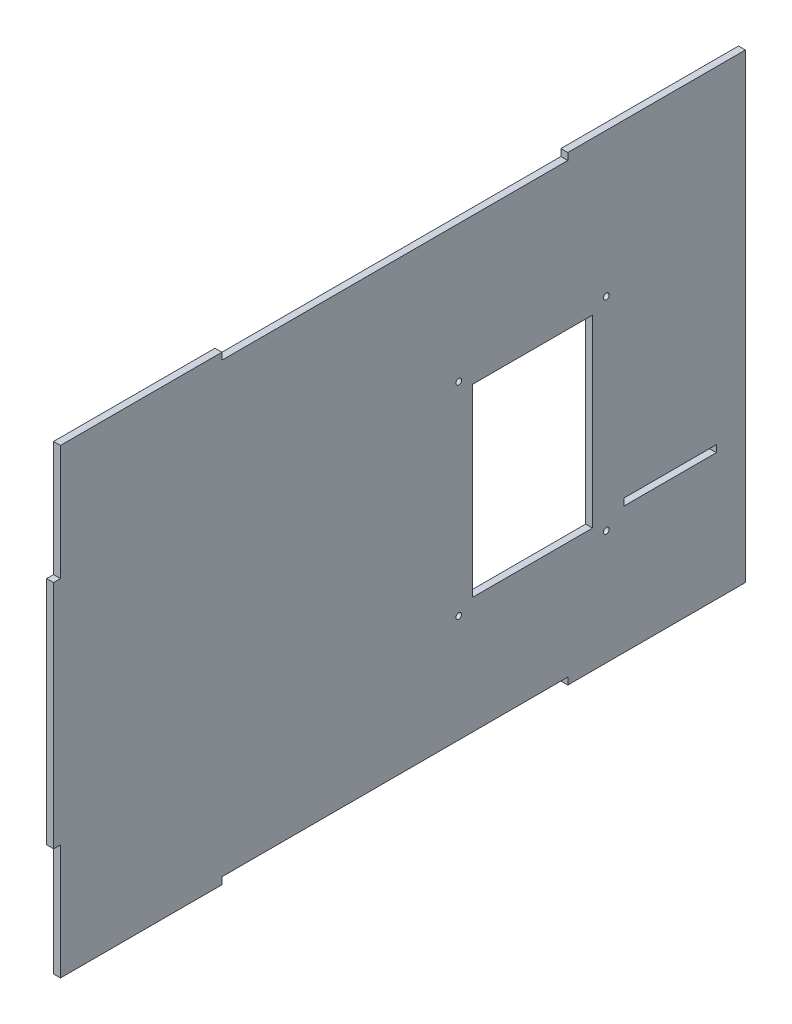
ISO-10303-21;
HEADER;
FILE_DESCRIPTION(('STEP AP214'),'2;1');
FILE_NAME('part.step','',(''),(''),'','','');
FILE_SCHEMA(('AUTOMOTIVE_DESIGN { 1 0 10303 214 1 1 1 1 }'));
ENDSEC;
DATA;
#1=APPLICATION_CONTEXT('core data for automotive mechanical design processes');
#2=APPLICATION_PROTOCOL_DEFINITION('international standard','automotive_design',2000,#1);
#3=PRODUCT_CONTEXT('',#1,'mechanical');
#4=PRODUCT('Part','Part','',(#3));
#5=PRODUCT_RELATED_PRODUCT_CATEGORY('part','',(#4));
#6=PRODUCT_DEFINITION_FORMATION('','',#4);
#7=PRODUCT_DEFINITION_CONTEXT('part definition',#1,'design');
#8=PRODUCT_DEFINITION('design','',#6,#7);
#9=PRODUCT_DEFINITION_SHAPE('','',#8);
#10=(LENGTH_UNIT() NAMED_UNIT(*) SI_UNIT(.MILLI.,.METRE.));
#11=(NAMED_UNIT(*) PLANE_ANGLE_UNIT() SI_UNIT($,.RADIAN.));
#12=(NAMED_UNIT(*) SI_UNIT($,.STERADIAN.) SOLID_ANGLE_UNIT());
#13=UNCERTAINTY_MEASURE_WITH_UNIT(LENGTH_MEASURE(1.E-05),#10,'distance_accuracy_value','');
#14=(GEOMETRIC_REPRESENTATION_CONTEXT(3) GLOBAL_UNCERTAINTY_ASSIGNED_CONTEXT((#13)) GLOBAL_UNIT_ASSIGNED_CONTEXT((#10,
#11,#12)) REPRESENTATION_CONTEXT('',''));
#15=CARTESIAN_POINT('',(0.,0.,0.));
#16=DIRECTION('',(0.,0.,1.));
#17=DIRECTION('',(1.,0.,0.));
#18=AXIS2_PLACEMENT_3D('',#15,#16,#17);
#19=CARTESIAN_POINT('',(3.,0.,0.));
#20=DIRECTION('',(1.,0.,0.));
#21=DIRECTION('',(0.,1.,0.));
#22=AXIS2_PLACEMENT_3D('',#19,#20,#21);
#23=PLANE('',#22);
#24=DIRECTION('',(0.,1.,0.));
#25=VECTOR('',#24,1.);
#26=CARTESIAN_POINT('',(3.,33.6,-181.72));
#27=LINE('',#26,#25);
#28=CARTESIAN_POINT('',(3.,-46.4,-181.72));
#29=VERTEX_POINT('',#28);
#30=CARTESIAN_POINT('',(3.,33.6,-181.72));
#31=VERTEX_POINT('',#30);
#32=EDGE_CURVE('E204',#29,#31,#27,.T.);
#33=ORIENTED_EDGE('',*,*,#32,.T.);
#34=DIRECTION('',(0.,0.,-1.));
#35=VECTOR('',#34,1.);
#36=CARTESIAN_POINT('',(3.,33.6,-233.72));
#37=LINE('',#36,#35);
#38=CARTESIAN_POINT('',(3.,33.6,-233.72));
#39=VERTEX_POINT('',#38);
#40=EDGE_CURVE('E184',#31,#39,#37,.T.);
#41=ORIENTED_EDGE('',*,*,#40,.T.);
#42=DIRECTION('',(0.,-1.,0.));
#43=VECTOR('',#42,1.);
#44=CARTESIAN_POINT('',(3.,-46.4,-233.72));
#45=LINE('',#44,#43);
#46=CARTESIAN_POINT('',(3.,-46.4,-233.72));
#47=VERTEX_POINT('',#46);
#48=EDGE_CURVE('E31',#39,#47,#45,.T.);
#49=ORIENTED_EDGE('',*,*,#48,.T.);
#50=DIRECTION('',(0.,0.,1.));
#51=VECTOR('',#50,1.);
#52=CARTESIAN_POINT('',(3.,-46.4,-181.72));
#53=LINE('',#52,#51);
#54=EDGE_CURVE('E201',#47,#29,#53,.T.);
#55=ORIENTED_EDGE('',*,*,#54,.T.);
#56=EDGE_LOOP('',(#33,#41,#49,#55));
#57=FACE_BOUND('',#56,.T.);
#58=DIRECTION('',(0.,-1.,0.));
#59=VECTOR('',#58,1.);
#60=CARTESIAN_POINT('',(3.,-44.93,-287.43));
#61=LINE('',#60,#59);
#62=CARTESIAN_POINT('',(3.,-41.93,-287.43));
#63=VERTEX_POINT('',#62);
#64=CARTESIAN_POINT('',(3.,-44.93,-287.43));
#65=VERTEX_POINT('',#64);
#66=EDGE_CURVE('E226',#63,#65,#61,.T.);
#67=ORIENTED_EDGE('',*,*,#66,.T.);
#68=DIRECTION('',(0.,0.,1.));
#69=VECTOR('',#68,1.);
#70=CARTESIAN_POINT('',(3.,-44.93,-247.43));
#71=LINE('',#70,#69);
#72=CARTESIAN_POINT('',(3.,-44.93,-247.43));
#73=VERTEX_POINT('',#72);
#74=EDGE_CURVE('E238',#65,#73,#71,.T.);
#75=ORIENTED_EDGE('',*,*,#74,.T.);
#76=DIRECTION('',(0.,1.,0.));
#77=VECTOR('',#76,1.);
#78=CARTESIAN_POINT('',(3.,-41.93,-247.43));
#79=LINE('',#78,#77);
#80=CARTESIAN_POINT('',(3.,-41.93,-247.43));
#81=VERTEX_POINT('',#80);
#82=EDGE_CURVE('E220',#73,#81,#79,.T.);
#83=ORIENTED_EDGE('',*,*,#82,.T.);
#84=DIRECTION('',(0.,0.,-1.));
#85=VECTOR('',#84,1.);
#86=CARTESIAN_POINT('',(3.,-41.93,-287.43));
#87=LINE('',#86,#85);
#88=EDGE_CURVE('E223',#81,#63,#87,.T.);
#89=ORIENTED_EDGE('',*,*,#88,.T.);
#90=EDGE_LOOP('',(#67,#75,#83,#89));
#91=FACE_BOUND('',#90,.T.);
#92=CARTESIAN_POINT('',(3.,37.6,-239.72));
#93=DIRECTION('',(1.,0.,0.));
#94=DIRECTION('',(0.,1.,0.));
#95=AXIS2_PLACEMENT_3D('',#92,#93,#94);
#96=CIRCLE('',#95,1.25);
#97=CARTESIAN_POINT('',(3.,38.85,-239.72));
#98=VERTEX_POINT('',#97);
#99=EDGE_CURVE('E250',#98,#98,#96,.T.);
#100=ORIENTED_EDGE('',*,*,#99,.F.);
#101=EDGE_LOOP('',(#100));
#102=FACE_BOUND('',#101,.T.);
#103=CARTESIAN_POINT('',(3.,-50.4,-175.72));
#104=DIRECTION('',(1.,0.,0.));
#105=DIRECTION('',(0.,1.,0.));
#106=AXIS2_PLACEMENT_3D('',#103,#104,#105);
#107=CIRCLE('',#106,1.25);
#108=CARTESIAN_POINT('',(3.,-49.15,-175.72));
#109=VERTEX_POINT('',#108);
#110=EDGE_CURVE('E262',#109,#109,#107,.T.);
#111=ORIENTED_EDGE('',*,*,#110,.F.);
#112=EDGE_LOOP('',(#111));
#113=FACE_BOUND('',#112,.T.);
#114=DIRECTION('',(0.,-1.,0.));
#115=VECTOR('',#114,1.);
#116=CARTESIAN_POINT('',(2.99999999999999,-100.,-3.));
#117=LINE('',#116,#115);
#118=CARTESIAN_POINT('',(3.,-50.,-3.));
#119=VERTEX_POINT('',#118);
#120=CARTESIAN_POINT('',(2.99999999999999,-100.,-3.));
#121=VERTEX_POINT('',#120);
#122=EDGE_CURVE('E335',#119,#121,#117,.T.);
#123=ORIENTED_EDGE('',*,*,#122,.T.);
#124=DIRECTION('',(0.,0.,-1.));
#125=VECTOR('',#124,1.);
#126=CARTESIAN_POINT('',(2.99999999999999,-100.,-3.));
#127=LINE('',#126,#125);
#128=CARTESIAN_POINT('',(2.99999999999999,-100.,-73.));
#129=VERTEX_POINT('',#128);
#130=EDGE_CURVE('E332',#121,#129,#127,.T.);
#131=ORIENTED_EDGE('',*,*,#130,.T.);
#132=DIRECTION('',(0.,1.,0.));
#133=VECTOR('',#132,1.);
#134=CARTESIAN_POINT('',(2.99999999999999,-100.,-73.));
#135=LINE('',#134,#133);
#136=CARTESIAN_POINT('',(2.99999999999999,-97.,-73.));
#137=VERTEX_POINT('',#136);
#138=EDGE_CURVE('E334',#129,#137,#135,.T.);
#139=ORIENTED_EDGE('',*,*,#138,.T.);
#140=DIRECTION('',(0.,0.,-1.));
#141=VECTOR('',#140,1.);
#142=CARTESIAN_POINT('',(2.99999999999999,-97.,-73.));
#143=LINE('',#142,#141);
#144=CARTESIAN_POINT('',(2.99999999999999,-97.,-223.));
#145=VERTEX_POINT('',#144);
#146=EDGE_CURVE('E337',#137,#145,#143,.T.);
#147=ORIENTED_EDGE('',*,*,#146,.T.);
#148=DIRECTION('',(0.,-1.,0.));
#149=VECTOR('',#148,1.);
#150=CARTESIAN_POINT('',(2.99999999999999,-97.,-223.));
#151=LINE('',#150,#149);
#152=CARTESIAN_POINT('',(2.99999999999999,-100.,-223.));
#153=VERTEX_POINT('',#152);
#154=EDGE_CURVE('E339',#145,#153,#151,.T.);
#155=ORIENTED_EDGE('',*,*,#154,.T.);
#156=DIRECTION('',(0.,0.,-1.));
#157=VECTOR('',#156,1.);
#158=CARTESIAN_POINT('',(2.99999999999999,-100.,-223.));
#159=LINE('',#158,#157);
#160=CARTESIAN_POINT('',(2.99999999999999,-100.,-300.));
#161=VERTEX_POINT('',#160);
#162=EDGE_CURVE('E341',#153,#161,#159,.T.);
#163=ORIENTED_EDGE('',*,*,#162,.T.);
#164=DIRECTION('',(0.,1.,0.));
#165=VECTOR('',#164,1.);
#166=CARTESIAN_POINT('',(2.99999999999999,-100.,-300.));
#167=LINE('',#166,#165);
#168=CARTESIAN_POINT('',(2.99999999999999,100.,-300.));
#169=VERTEX_POINT('',#168);
#170=EDGE_CURVE('E343',#161,#169,#167,.T.);
#171=ORIENTED_EDGE('',*,*,#170,.T.);
#172=DIRECTION('',(0.,0.,1.));
#173=VECTOR('',#172,1.);
#174=CARTESIAN_POINT('',(2.99999999999999,100.,-300.));
#175=LINE('',#174,#173);
#176=CARTESIAN_POINT('',(2.99999999999999,100.,-223.));
#177=VERTEX_POINT('',#176);
#178=EDGE_CURVE('E275',#169,#177,#175,.T.);
#179=ORIENTED_EDGE('',*,*,#178,.T.);
#180=DIRECTION('',(0.,-1.,0.));
#181=VECTOR('',#180,1.);
#182=CARTESIAN_POINT('',(2.99999999999999,100.,-223.));
#183=LINE('',#182,#181);
#184=CARTESIAN_POINT('',(2.99999999999999,97.,-223.));
#185=VERTEX_POINT('',#184);
#186=EDGE_CURVE('E277',#177,#185,#183,.T.);
#187=ORIENTED_EDGE('',*,*,#186,.T.);
#188=DIRECTION('',(0.,0.,1.));
#189=VECTOR('',#188,1.);
#190=CARTESIAN_POINT('',(2.99999999999999,97.,-223.));
#191=LINE('',#190,#189);
#192=CARTESIAN_POINT('',(2.99999999999999,97.,-73.));
#193=VERTEX_POINT('',#192);
#194=EDGE_CURVE('E279',#185,#193,#191,.T.);
#195=ORIENTED_EDGE('',*,*,#194,.T.);
#196=DIRECTION('',(0.,1.,0.));
#197=VECTOR('',#196,1.);
#198=CARTESIAN_POINT('',(2.99999999999999,97.,-73.));
#199=LINE('',#198,#197);
#200=CARTESIAN_POINT('',(2.99999999999999,100.,-73.));
#201=VERTEX_POINT('',#200);
#202=EDGE_CURVE('E281',#193,#201,#199,.T.);
#203=ORIENTED_EDGE('',*,*,#202,.T.);
#204=DIRECTION('',(0.,0.,1.));
#205=VECTOR('',#204,1.);
#206=CARTESIAN_POINT('',(2.99999999999999,100.,-73.));
#207=LINE('',#206,#205);
#208=CARTESIAN_POINT('',(2.99999999999999,100.,-3.));
#209=VERTEX_POINT('',#208);
#210=EDGE_CURVE('E272',#201,#209,#207,.T.);
#211=ORIENTED_EDGE('',*,*,#210,.T.);
#212=DIRECTION('',(0.,-1.,0.));
#213=VECTOR('',#212,1.);
#214=CARTESIAN_POINT('',(2.99999999999999,100.,-3.));
#215=LINE('',#214,#213);
#216=CARTESIAN_POINT('',(3.,50.,-3.));
#217=VERTEX_POINT('',#216);
#218=EDGE_CURVE('E269',#209,#217,#215,.T.);
#219=ORIENTED_EDGE('',*,*,#218,.T.);
#220=DIRECTION('',(0.,0.,1.));
#221=VECTOR('',#220,1.);
#222=CARTESIAN_POINT('',(3.,50.,-3.));
#223=LINE('',#222,#221);
#224=CARTESIAN_POINT('',(3.,50.,0.));
#225=VERTEX_POINT('',#224);
#226=EDGE_CURVE('E271',#217,#225,#223,.T.);
#227=ORIENTED_EDGE('',*,*,#226,.T.);
#228=DIRECTION('',(0.,-1.,0.));
#229=VECTOR('',#228,1.);
#230=CARTESIAN_POINT('',(3.,-50.,0.));
#231=LINE('',#230,#229);
#232=CARTESIAN_POINT('',(3.,-50.,0.));
#233=VERTEX_POINT('',#232);
#234=EDGE_CURVE('E345',#225,#233,#231,.T.);
#235=ORIENTED_EDGE('',*,*,#234,.T.);
#236=DIRECTION('',(0.,0.,-1.));
#237=VECTOR('',#236,1.);
#238=CARTESIAN_POINT('',(3.,-50.,-3.));
#239=LINE('',#238,#237);
#240=EDGE_CURVE('E347',#233,#119,#239,.T.);
#241=ORIENTED_EDGE('',*,*,#240,.T.);
#242=EDGE_LOOP('',(#123,#131,#139,#147,#155,#163,#171,#179,#187,#195,#203,#211,#219,#227,#235,#241));
#243=FACE_BOUND('',#242,.T.);
#244=CARTESIAN_POINT('',(3.,37.6,-175.72));
#245=DIRECTION('',(1.,0.,0.));
#246=DIRECTION('',(0.,1.,0.));
#247=AXIS2_PLACEMENT_3D('',#244,#245,#246);
#248=CIRCLE('',#247,1.25);
#249=CARTESIAN_POINT('',(3.,38.85,-175.72));
#250=VERTEX_POINT('',#249);
#251=EDGE_CURVE('E256',#250,#250,#248,.T.);
#252=ORIENTED_EDGE('',*,*,#251,.F.);
#253=EDGE_LOOP('',(#252));
#254=FACE_BOUND('',#253,.T.);
#255=CARTESIAN_POINT('',(3.,-50.4,-239.72));
#256=DIRECTION('',(1.,0.,0.));
#257=DIRECTION('',(0.,1.,0.));
#258=AXIS2_PLACEMENT_3D('',#255,#256,#257);
#259=CIRCLE('',#258,1.25);
#260=CARTESIAN_POINT('',(3.,-49.15,-239.72));
#261=VERTEX_POINT('',#260);
#262=EDGE_CURVE('E244',#261,#261,#259,.T.);
#263=ORIENTED_EDGE('',*,*,#262,.F.);
#264=EDGE_LOOP('',(#263));
#265=FACE_BOUND('',#264,.T.);
#266=ADVANCED_FACE('F16',(#57,#91,#102,#113,#243,#254,#265),#23,.T.);
#267=CARTESIAN_POINT('',(0.,0.,0.));
#268=DIRECTION('',(1.,0.,0.));
#269=DIRECTION('',(0.,1.,0.));
#270=AXIS2_PLACEMENT_3D('',#267,#268,#269);
#271=PLANE('',#270);
#272=DIRECTION('',(0.,0.,1.));
#273=VECTOR('',#272,1.);
#274=CARTESIAN_POINT('',(0.,33.6,-233.72));
#275=LINE('',#274,#273);
#276=CARTESIAN_POINT('',(0.,33.6,-233.72));
#277=VERTEX_POINT('',#276);
#278=CARTESIAN_POINT('',(0.,33.6,-181.72));
#279=VERTEX_POINT('',#278);
#280=EDGE_CURVE('E176',#277,#279,#275,.T.);
#281=ORIENTED_EDGE('',*,*,#280,.T.);
#282=DIRECTION('',(0.,-1.,0.));
#283=VECTOR('',#282,1.);
#284=CARTESIAN_POINT('',(0.,33.6,-181.72));
#285=LINE('',#284,#283);
#286=CARTESIAN_POINT('',(0.,-46.4,-181.72));
#287=VERTEX_POINT('',#286);
#288=EDGE_CURVE('E196',#279,#287,#285,.T.);
#289=ORIENTED_EDGE('',*,*,#288,.T.);
#290=DIRECTION('',(0.,0.,-1.));
#291=VECTOR('',#290,1.);
#292=CARTESIAN_POINT('',(0.,-46.4,-181.72));
#293=LINE('',#292,#291);
#294=CARTESIAN_POINT('',(0.,-46.4,-233.72));
#295=VERTEX_POINT('',#294);
#296=EDGE_CURVE('E194',#287,#295,#293,.T.);
#297=ORIENTED_EDGE('',*,*,#296,.T.);
#298=DIRECTION('',(0.,1.,0.));
#299=VECTOR('',#298,1.);
#300=CARTESIAN_POINT('',(0.,-46.4,-233.72));
#301=LINE('',#300,#299);
#302=EDGE_CURVE('E187',#295,#277,#301,.T.);
#303=ORIENTED_EDGE('',*,*,#302,.T.);
#304=EDGE_LOOP('',(#281,#289,#297,#303));
#305=FACE_BOUND('',#304,.T.);
#306=DIRECTION('',(0.,0.,-1.));
#307=VECTOR('',#306,1.);
#308=CARTESIAN_POINT('',(0.,-44.93,-247.43));
#309=LINE('',#308,#307);
#310=CARTESIAN_POINT('',(0.,-44.93,-247.43));
#311=VERTEX_POINT('',#310);
#312=CARTESIAN_POINT('',(0.,-44.93,-287.43));
#313=VERTEX_POINT('',#312);
#314=EDGE_CURVE('E241',#311,#313,#309,.T.);
#315=ORIENTED_EDGE('',*,*,#314,.T.);
#316=DIRECTION('',(0.,1.,0.));
#317=VECTOR('',#316,1.);
#318=CARTESIAN_POINT('',(0.,-44.93,-287.43));
#319=LINE('',#318,#317);
#320=CARTESIAN_POINT('',(0.,-41.93,-287.43));
#321=VERTEX_POINT('',#320);
#322=EDGE_CURVE('E217',#313,#321,#319,.T.);
#323=ORIENTED_EDGE('',*,*,#322,.T.);
#324=DIRECTION('',(0.,0.,1.));
#325=VECTOR('',#324,1.);
#326=CARTESIAN_POINT('',(0.,-41.93,-287.43));
#327=LINE('',#326,#325);
#328=CARTESIAN_POINT('',(0.,-41.93,-247.43));
#329=VERTEX_POINT('',#328);
#330=EDGE_CURVE('E214',#321,#329,#327,.T.);
#331=ORIENTED_EDGE('',*,*,#330,.T.);
#332=DIRECTION('',(0.,-1.,0.));
#333=VECTOR('',#332,1.);
#334=CARTESIAN_POINT('',(0.,-41.93,-247.43));
#335=LINE('',#334,#333);
#336=EDGE_CURVE('E183',#329,#311,#335,.T.);
#337=ORIENTED_EDGE('',*,*,#336,.T.);
#338=EDGE_LOOP('',(#315,#323,#331,#337));
#339=FACE_BOUND('',#338,.T.);
#340=CARTESIAN_POINT('',(0.,37.6,-239.72));
#341=DIRECTION('',(-1.,0.,0.));
#342=DIRECTION('',(0.,-1.,0.));
#343=AXIS2_PLACEMENT_3D('',#340,#341,#342);
#344=CIRCLE('',#343,1.25);
#345=CARTESIAN_POINT('',(0.,36.35,-239.72));
#346=VERTEX_POINT('',#345);
#347=EDGE_CURVE('E253',#346,#346,#344,.T.);
#348=ORIENTED_EDGE('',*,*,#347,.F.);
#349=EDGE_LOOP('',(#348));
#350=FACE_BOUND('',#349,.T.);
#351=CARTESIAN_POINT('',(0.,-50.4,-175.72));
#352=DIRECTION('',(-1.,0.,0.));
#353=DIRECTION('',(0.,-1.,0.));
#354=AXIS2_PLACEMENT_3D('',#351,#352,#353);
#355=CIRCLE('',#354,1.25);
#356=CARTESIAN_POINT('',(0.,-51.65,-175.72));
#357=VERTEX_POINT('',#356);
#358=EDGE_CURVE('E265',#357,#357,#355,.T.);
#359=ORIENTED_EDGE('',*,*,#358,.F.);
#360=EDGE_LOOP('',(#359));
#361=FACE_BOUND('',#360,.T.);
#362=DIRECTION('',(0.,-1.,0.));
#363=VECTOR('',#362,1.);
#364=CARTESIAN_POINT('',(0.,-100.,-3.));
#365=LINE('',#364,#363);
#366=CARTESIAN_POINT('',(0.,-50.,-3.));
#367=VERTEX_POINT('',#366);
#368=CARTESIAN_POINT('',(0.,-100.,-3.));
#369=VERTEX_POINT('',#368);
#370=EDGE_CURVE('E331',#367,#369,#365,.T.);
#371=ORIENTED_EDGE('',*,*,#370,.F.);
#372=DIRECTION('',(0.,0.,-1.));
#373=VECTOR('',#372,1.);
#374=CARTESIAN_POINT('',(0.,-50.,-3.));
#375=LINE('',#374,#373);
#376=CARTESIAN_POINT('',(0.,-50.,0.));
#377=VERTEX_POINT('',#376);
#378=EDGE_CURVE('E352',#377,#367,#375,.T.);
#379=ORIENTED_EDGE('',*,*,#378,.F.);
#380=DIRECTION('',(0.,-1.,0.));
#381=VECTOR('',#380,1.);
#382=CARTESIAN_POINT('',(0.,-50.,0.));
#383=LINE('',#382,#381);
#384=CARTESIAN_POINT('',(0.,50.,0.));
#385=VERTEX_POINT('',#384);
#386=EDGE_CURVE('E371',#385,#377,#383,.T.);
#387=ORIENTED_EDGE('',*,*,#386,.F.);
#388=DIRECTION('',(0.,0.,1.));
#389=VECTOR('',#388,1.);
#390=CARTESIAN_POINT('',(0.,50.,-3.));
#391=LINE('',#390,#389);
#392=CARTESIAN_POINT('',(0.,50.,-3.));
#393=VERTEX_POINT('',#392);
#394=EDGE_CURVE('E290',#393,#385,#391,.T.);
#395=ORIENTED_EDGE('',*,*,#394,.F.);
#396=DIRECTION('',(0.,-1.,0.));
#397=VECTOR('',#396,1.);
#398=CARTESIAN_POINT('',(0.,100.,-3.));
#399=LINE('',#398,#397);
#400=CARTESIAN_POINT('',(0.,100.,-3.));
#401=VERTEX_POINT('',#400);
#402=EDGE_CURVE('E287',#401,#393,#399,.T.);
#403=ORIENTED_EDGE('',*,*,#402,.F.);
#404=DIRECTION('',(0.,0.,1.));
#405=VECTOR('',#404,1.);
#406=CARTESIAN_POINT('',(0.,100.,-73.));
#407=LINE('',#406,#405);
#408=CARTESIAN_POINT('',(0.,100.,-73.));
#409=VERTEX_POINT('',#408);
#410=EDGE_CURVE('E268',#409,#401,#407,.T.);
#411=ORIENTED_EDGE('',*,*,#410,.F.);
#412=DIRECTION('',(0.,1.,0.));
#413=VECTOR('',#412,1.);
#414=CARTESIAN_POINT('',(0.,97.,-73.));
#415=LINE('',#414,#413);
#416=CARTESIAN_POINT('',(0.,97.,-73.));
#417=VERTEX_POINT('',#416);
#418=EDGE_CURVE('E286',#417,#409,#415,.T.);
#419=ORIENTED_EDGE('',*,*,#418,.F.);
#420=DIRECTION('',(0.,0.,1.));
#421=VECTOR('',#420,1.);
#422=CARTESIAN_POINT('',(0.,97.,-223.));
#423=LINE('',#422,#421);
#424=CARTESIAN_POINT('',(0.,97.,-223.));
#425=VERTEX_POINT('',#424);
#426=EDGE_CURVE('E300',#425,#417,#423,.T.);
#427=ORIENTED_EDGE('',*,*,#426,.F.);
#428=DIRECTION('',(0.,-1.,0.));
#429=VECTOR('',#428,1.);
#430=CARTESIAN_POINT('',(0.,100.,-223.));
#431=LINE('',#430,#429);
#432=CARTESIAN_POINT('',(0.,100.,-223.));
#433=VERTEX_POINT('',#432);
#434=EDGE_CURVE('E297',#433,#425,#431,.T.);
#435=ORIENTED_EDGE('',*,*,#434,.F.);
#436=DIRECTION('',(0.,0.,1.));
#437=VECTOR('',#436,1.);
#438=CARTESIAN_POINT('',(0.,100.,-300.));
#439=LINE('',#438,#437);
#440=CARTESIAN_POINT('',(0.,100.,-300.));
#441=VERTEX_POINT('',#440);
#442=EDGE_CURVE('E294',#441,#433,#439,.T.);
#443=ORIENTED_EDGE('',*,*,#442,.F.);
#444=DIRECTION('',(0.,1.,0.));
#445=VECTOR('',#444,1.);
#446=CARTESIAN_POINT('',(0.,-100.,-300.));
#447=LINE('',#446,#445);
#448=CARTESIAN_POINT('',(0.,-100.,-300.));
#449=VERTEX_POINT('',#448);
#450=EDGE_CURVE('E368',#449,#441,#447,.T.);
#451=ORIENTED_EDGE('',*,*,#450,.F.);
#452=DIRECTION('',(0.,0.,-1.));
#453=VECTOR('',#452,1.);
#454=CARTESIAN_POINT('',(0.,-100.,-223.));
#455=LINE('',#454,#453);
#456=CARTESIAN_POINT('',(0.,-100.,-223.));
#457=VERTEX_POINT('',#456);
#458=EDGE_CURVE('E365',#457,#449,#455,.T.);
#459=ORIENTED_EDGE('',*,*,#458,.F.);
#460=DIRECTION('',(0.,-1.,0.));
#461=VECTOR('',#460,1.);
#462=CARTESIAN_POINT('',(0.,-97.,-223.));
#463=LINE('',#462,#461);
#464=CARTESIAN_POINT('',(0.,-97.,-223.));
#465=VERTEX_POINT('',#464);
#466=EDGE_CURVE('E362',#465,#457,#463,.T.);
#467=ORIENTED_EDGE('',*,*,#466,.F.);
#468=DIRECTION('',(0.,0.,-1.));
#469=VECTOR('',#468,1.);
#470=CARTESIAN_POINT('',(0.,-97.,-73.));
#471=LINE('',#470,#469);
#472=CARTESIAN_POINT('',(0.,-97.,-73.));
#473=VERTEX_POINT('',#472);
#474=EDGE_CURVE('E359',#473,#465,#471,.T.);
#475=ORIENTED_EDGE('',*,*,#474,.F.);
#476=DIRECTION('',(0.,1.,0.));
#477=VECTOR('',#476,1.);
#478=CARTESIAN_POINT('',(0.,-100.,-73.));
#479=LINE('',#478,#477);
#480=CARTESIAN_POINT('',(0.,-100.,-73.));
#481=VERTEX_POINT('',#480);
#482=EDGE_CURVE('E356',#481,#473,#479,.T.);
#483=ORIENTED_EDGE('',*,*,#482,.F.);
#484=DIRECTION('',(0.,0.,-1.));
#485=VECTOR('',#484,1.);
#486=CARTESIAN_POINT('',(0.,-100.,-3.));
#487=LINE('',#486,#485);
#488=EDGE_CURVE('E353',#369,#481,#487,.T.);
#489=ORIENTED_EDGE('',*,*,#488,.F.);
#490=EDGE_LOOP('',(#371,#379,#387,#395,#403,#411,#419,#427,#435,#443,#451,#459,#467,#475,#483,#489));
#491=FACE_BOUND('',#490,.T.);
#492=CARTESIAN_POINT('',(0.,37.6,-175.72));
#493=DIRECTION('',(-1.,0.,0.));
#494=DIRECTION('',(0.,-1.,0.));
#495=AXIS2_PLACEMENT_3D('',#492,#493,#494);
#496=CIRCLE('',#495,1.25);
#497=CARTESIAN_POINT('',(0.,36.35,-175.72));
#498=VERTEX_POINT('',#497);
#499=EDGE_CURVE('E259',#498,#498,#496,.T.);
#500=ORIENTED_EDGE('',*,*,#499,.F.);
#501=EDGE_LOOP('',(#500));
#502=FACE_BOUND('',#501,.T.);
#503=CARTESIAN_POINT('',(0.,-50.4,-239.72));
#504=DIRECTION('',(-1.,0.,0.));
#505=DIRECTION('',(0.,-1.,0.));
#506=AXIS2_PLACEMENT_3D('',#503,#504,#505);
#507=CIRCLE('',#506,1.25);
#508=CARTESIAN_POINT('',(0.,-51.65,-239.72));
#509=VERTEX_POINT('',#508);
#510=EDGE_CURVE('E247',#509,#509,#507,.T.);
#511=ORIENTED_EDGE('',*,*,#510,.F.);
#512=EDGE_LOOP('',(#511));
#513=FACE_BOUND('',#512,.T.);
#514=ADVANCED_FACE('F192',(#305,#339,#350,#361,#491,#502,#513),#271,.F.);
#515=CARTESIAN_POINT('',(2.99999999999999,-100.,-3.));
#516=DIRECTION('',(0.,0.,-1.));
#517=DIRECTION('',(-1.,0.,0.));
#518=AXIS2_PLACEMENT_3D('',#515,#516,#517);
#519=PLANE('',#518);
#520=ORIENTED_EDGE('',*,*,#370,.T.);
#521=DIRECTION('',(-1.,0.,0.));
#522=VECTOR('',#521,1.);
#523=CARTESIAN_POINT('',(2.99999999999999,-100.,-3.));
#524=LINE('',#523,#522);
#525=EDGE_CURVE('E10',#121,#369,#524,.T.);
#526=ORIENTED_EDGE('',*,*,#525,.F.);
#527=ORIENTED_EDGE('',*,*,#122,.F.);
#528=DIRECTION('',(-1.,0.,0.));
#529=VECTOR('',#528,1.);
#530=CARTESIAN_POINT('',(3.,-50.,-3.));
#531=LINE('',#530,#529);
#532=EDGE_CURVE('E349',#119,#367,#531,.T.);
#533=ORIENTED_EDGE('',*,*,#532,.T.);
#534=EDGE_LOOP('',(#520,#526,#527,#533));
#535=FACE_BOUND('',#534,.T.);
#536=ADVANCED_FACE('F18',(#535),#519,.F.);
#537=CARTESIAN_POINT('',(2.99999999999999,-100.,-3.));
#538=DIRECTION('',(0.,1.,0.));
#539=DIRECTION('',(0.,0.,1.));
#540=AXIS2_PLACEMENT_3D('',#537,#538,#539);
#541=PLANE('',#540);
#542=ORIENTED_EDGE('',*,*,#488,.T.);
#543=DIRECTION('',(-1.,0.,0.));
#544=VECTOR('',#543,1.);
#545=CARTESIAN_POINT('',(2.99999999999999,-100.,-73.));
#546=LINE('',#545,#544);
#547=EDGE_CURVE('E24',#129,#481,#546,.T.);
#548=ORIENTED_EDGE('',*,*,#547,.F.);
#549=ORIENTED_EDGE('',*,*,#130,.F.);
#550=ORIENTED_EDGE('',*,*,#525,.T.);
#551=EDGE_LOOP('',(#542,#548,#549,#550));
#552=FACE_BOUND('',#551,.T.);
#553=ADVANCED_FACE('F423',(#552),#541,.F.);
#554=CARTESIAN_POINT('',(2.99999999999999,-100.,-73.));
#555=DIRECTION('',(0.,0.,1.));
#556=DIRECTION('',(1.,0.,0.));
#557=AXIS2_PLACEMENT_3D('',#554,#555,#556);
#558=PLANE('',#557);
#559=ORIENTED_EDGE('',*,*,#482,.T.);
#560=DIRECTION('',(-1.,0.,0.));
#561=VECTOR('',#560,1.);
#562=CARTESIAN_POINT('',(2.99999999999999,-97.,-73.));
#563=LINE('',#562,#561);
#564=EDGE_CURVE('E393',#137,#473,#563,.T.);
#565=ORIENTED_EDGE('',*,*,#564,.F.);
#566=ORIENTED_EDGE('',*,*,#138,.F.);
#567=ORIENTED_EDGE('',*,*,#547,.T.);
#568=EDGE_LOOP('',(#559,#565,#566,#567));
#569=FACE_BOUND('',#568,.T.);
#570=ADVANCED_FACE('F400',(#569),#558,.F.);
#571=CARTESIAN_POINT('',(2.99999999999999,-97.,-73.));
#572=DIRECTION('',(0.,1.,0.));
#573=DIRECTION('',(0.,0.,1.));
#574=AXIS2_PLACEMENT_3D('',#571,#572,#573);
#575=PLANE('',#574);
#576=ORIENTED_EDGE('',*,*,#474,.T.);
#577=DIRECTION('',(-1.,0.,0.));
#578=VECTOR('',#577,1.);
#579=CARTESIAN_POINT('',(2.99999999999999,-97.,-223.));
#580=LINE('',#579,#578);
#581=EDGE_CURVE('E390',#145,#465,#580,.T.);
#582=ORIENTED_EDGE('',*,*,#581,.F.);
#583=ORIENTED_EDGE('',*,*,#146,.F.);
#584=ORIENTED_EDGE('',*,*,#564,.T.);
#585=EDGE_LOOP('',(#576,#582,#583,#584));
#586=FACE_BOUND('',#585,.T.);
#587=ADVANCED_FACE('F411',(#586),#575,.F.);
#588=CARTESIAN_POINT('',(2.99999999999999,-97.,-223.));
#589=DIRECTION('',(0.,0.,-1.));
#590=DIRECTION('',(-1.,0.,0.));
#591=AXIS2_PLACEMENT_3D('',#588,#589,#590);
#592=PLANE('',#591);
#593=ORIENTED_EDGE('',*,*,#466,.T.);
#594=DIRECTION('',(-1.,0.,0.));
#595=VECTOR('',#594,1.);
#596=CARTESIAN_POINT('',(2.99999999999999,-100.,-223.));
#597=LINE('',#596,#595);
#598=EDGE_CURVE('E387',#153,#457,#597,.T.);
#599=ORIENTED_EDGE('',*,*,#598,.F.);
#600=ORIENTED_EDGE('',*,*,#154,.F.);
#601=ORIENTED_EDGE('',*,*,#581,.T.);
#602=EDGE_LOOP('',(#593,#599,#600,#601));
#603=FACE_BOUND('',#602,.T.);
#604=ADVANCED_FACE('F415',(#603),#592,.F.);
#605=CARTESIAN_POINT('',(2.99999999999999,-100.,-223.));
#606=DIRECTION('',(0.,1.,0.));
#607=DIRECTION('',(0.,0.,1.));
#608=AXIS2_PLACEMENT_3D('',#605,#606,#607);
#609=PLANE('',#608);
#610=ORIENTED_EDGE('',*,*,#458,.T.);
#611=DIRECTION('',(-1.,0.,0.));
#612=VECTOR('',#611,1.);
#613=CARTESIAN_POINT('',(2.99999999999999,-100.,-300.));
#614=LINE('',#613,#612);
#615=EDGE_CURVE('E384',#161,#449,#614,.T.);
#616=ORIENTED_EDGE('',*,*,#615,.F.);
#617=ORIENTED_EDGE('',*,*,#162,.F.);
#618=ORIENTED_EDGE('',*,*,#598,.T.);
#619=EDGE_LOOP('',(#610,#616,#617,#618));
#620=FACE_BOUND('',#619,.T.);
#621=ADVANCED_FACE('F472',(#620),#609,.F.);
#622=CARTESIAN_POINT('',(2.99999999999999,-100.,-300.));
#623=DIRECTION('',(0.,0.,1.));
#624=DIRECTION('',(1.,0.,0.));
#625=AXIS2_PLACEMENT_3D('',#622,#623,#624);
#626=PLANE('',#625);
#627=ORIENTED_EDGE('',*,*,#450,.T.);
#628=DIRECTION('',(-1.,0.,0.));
#629=VECTOR('',#628,1.);
#630=CARTESIAN_POINT('',(2.99999999999999,100.,-300.));
#631=LINE('',#630,#629);
#632=EDGE_CURVE('E319',#169,#441,#631,.T.);
#633=ORIENTED_EDGE('',*,*,#632,.F.);
#634=ORIENTED_EDGE('',*,*,#170,.F.);
#635=ORIENTED_EDGE('',*,*,#615,.T.);
#636=EDGE_LOOP('',(#627,#633,#634,#635));
#637=FACE_BOUND('',#636,.T.);
#638=ADVANCED_FACE('F469',(#637),#626,.F.);
#639=CARTESIAN_POINT('',(3.,-50.,0.));
#640=DIRECTION('',(0.,0.,-1.));
#641=DIRECTION('',(-1.,0.,0.));
#642=AXIS2_PLACEMENT_3D('',#639,#640,#641);
#643=PLANE('',#642);
#644=ORIENTED_EDGE('',*,*,#386,.T.);
#645=DIRECTION('',(-1.,0.,0.));
#646=VECTOR('',#645,1.);
#647=CARTESIAN_POINT('',(3.,-50.,0.));
#648=LINE('',#647,#646);
#649=EDGE_CURVE('E381',#233,#377,#648,.T.);
#650=ORIENTED_EDGE('',*,*,#649,.F.);
#651=ORIENTED_EDGE('',*,*,#234,.F.);
#652=DIRECTION('',(-1.,0.,0.));
#653=VECTOR('',#652,1.);
#654=CARTESIAN_POINT('',(3.,50.,0.));
#655=LINE('',#654,#653);
#656=EDGE_CURVE('E322',#225,#385,#655,.T.);
#657=ORIENTED_EDGE('',*,*,#656,.T.);
#658=EDGE_LOOP('',(#644,#650,#651,#657));
#659=FACE_BOUND('',#658,.T.);
#660=ADVANCED_FACE('F433',(#659),#643,.F.);
#661=CARTESIAN_POINT('',(3.,-50.,-3.));
#662=DIRECTION('',(0.,1.,0.));
#663=DIRECTION('',(0.,0.,1.));
#664=AXIS2_PLACEMENT_3D('',#661,#662,#663);
#665=PLANE('',#664);
#666=ORIENTED_EDGE('',*,*,#378,.T.);
#667=ORIENTED_EDGE('',*,*,#532,.F.);
#668=ORIENTED_EDGE('',*,*,#240,.F.);
#669=ORIENTED_EDGE('',*,*,#649,.T.);
#670=EDGE_LOOP('',(#666,#667,#668,#669));
#671=FACE_BOUND('',#670,.T.);
#672=ADVANCED_FACE('F429',(#671),#665,.F.);
#673=CARTESIAN_POINT('',(2.99999999999999,100.,-73.));
#674=DIRECTION('',(0.,-1.,0.));
#675=DIRECTION('',(0.,0.,-1.));
#676=AXIS2_PLACEMENT_3D('',#673,#674,#675);
#677=PLANE('',#676);
#678=ORIENTED_EDGE('',*,*,#410,.T.);
#679=DIRECTION('',(-1.,0.,0.));
#680=VECTOR('',#679,1.);
#681=CARTESIAN_POINT('',(2.99999999999999,100.,-3.));
#682=LINE('',#681,#680);
#683=EDGE_CURVE('E328',#209,#401,#682,.T.);
#684=ORIENTED_EDGE('',*,*,#683,.F.);
#685=ORIENTED_EDGE('',*,*,#210,.F.);
#686=DIRECTION('',(-1.,0.,0.));
#687=VECTOR('',#686,1.);
#688=CARTESIAN_POINT('',(2.99999999999999,100.,-73.));
#689=LINE('',#688,#687);
#690=EDGE_CURVE('E283',#201,#409,#689,.T.);
#691=ORIENTED_EDGE('',*,*,#690,.T.);
#692=EDGE_LOOP('',(#678,#684,#685,#691));
#693=FACE_BOUND('',#692,.T.);
#694=ADVANCED_FACE('F446',(#693),#677,.F.);
#695=CARTESIAN_POINT('',(2.99999999999999,100.,-3.));
#696=DIRECTION('',(0.,0.,-1.));
#697=DIRECTION('',(-1.,0.,0.));
#698=AXIS2_PLACEMENT_3D('',#695,#696,#697);
#699=PLANE('',#698);
#700=ORIENTED_EDGE('',*,*,#402,.T.);
#701=DIRECTION('',(-1.,0.,0.));
#702=VECTOR('',#701,1.);
#703=CARTESIAN_POINT('',(3.,50.,-3.));
#704=LINE('',#703,#702);
#705=EDGE_CURVE('E325',#217,#393,#704,.T.);
#706=ORIENTED_EDGE('',*,*,#705,.F.);
#707=ORIENTED_EDGE('',*,*,#218,.F.);
#708=ORIENTED_EDGE('',*,*,#683,.T.);
#709=EDGE_LOOP('',(#700,#706,#707,#708));
#710=FACE_BOUND('',#709,.T.);
#711=ADVANCED_FACE('F443',(#710),#699,.F.);
#712=CARTESIAN_POINT('',(3.,50.,-3.));
#713=DIRECTION('',(0.,-1.,0.));
#714=DIRECTION('',(0.,0.,-1.));
#715=AXIS2_PLACEMENT_3D('',#712,#713,#714);
#716=PLANE('',#715);
#717=ORIENTED_EDGE('',*,*,#394,.T.);
#718=ORIENTED_EDGE('',*,*,#656,.F.);
#719=ORIENTED_EDGE('',*,*,#226,.F.);
#720=ORIENTED_EDGE('',*,*,#705,.T.);
#721=EDGE_LOOP('',(#717,#718,#719,#720));
#722=FACE_BOUND('',#721,.T.);
#723=ADVANCED_FACE('F437',(#722),#716,.F.);
#724=CARTESIAN_POINT('',(2.99999999999999,100.,-300.));
#725=DIRECTION('',(0.,-1.,0.));
#726=DIRECTION('',(0.,0.,-1.));
#727=AXIS2_PLACEMENT_3D('',#724,#725,#726);
#728=PLANE('',#727);
#729=ORIENTED_EDGE('',*,*,#442,.T.);
#730=DIRECTION('',(-1.,0.,0.));
#731=VECTOR('',#730,1.);
#732=CARTESIAN_POINT('',(2.99999999999999,100.,-223.));
#733=LINE('',#732,#731);
#734=EDGE_CURVE('E316',#177,#433,#733,.T.);
#735=ORIENTED_EDGE('',*,*,#734,.F.);
#736=ORIENTED_EDGE('',*,*,#178,.F.);
#737=ORIENTED_EDGE('',*,*,#632,.T.);
#738=EDGE_LOOP('',(#729,#735,#736,#737));
#739=FACE_BOUND('',#738,.T.);
#740=ADVANCED_FACE('F465',(#739),#728,.F.);
#741=CARTESIAN_POINT('',(2.99999999999999,100.,-223.));
#742=DIRECTION('',(0.,0.,-1.));
#743=DIRECTION('',(-1.,0.,0.));
#744=AXIS2_PLACEMENT_3D('',#741,#742,#743);
#745=PLANE('',#744);
#746=ORIENTED_EDGE('',*,*,#434,.T.);
#747=DIRECTION('',(-1.,0.,0.));
#748=VECTOR('',#747,1.);
#749=CARTESIAN_POINT('',(2.99999999999999,97.,-223.));
#750=LINE('',#749,#748);
#751=EDGE_CURVE('E313',#185,#425,#750,.T.);
#752=ORIENTED_EDGE('',*,*,#751,.F.);
#753=ORIENTED_EDGE('',*,*,#186,.F.);
#754=ORIENTED_EDGE('',*,*,#734,.T.);
#755=EDGE_LOOP('',(#746,#752,#753,#754));
#756=FACE_BOUND('',#755,.T.);
#757=ADVANCED_FACE('F461',(#756),#745,.F.);
#758=CARTESIAN_POINT('',(2.99999999999999,97.,-223.));
#759=DIRECTION('',(0.,-1.,0.));
#760=DIRECTION('',(0.,0.,-1.));
#761=AXIS2_PLACEMENT_3D('',#758,#759,#760);
#762=PLANE('',#761);
#763=ORIENTED_EDGE('',*,*,#426,.T.);
#764=DIRECTION('',(-1.,0.,0.));
#765=VECTOR('',#764,1.);
#766=CARTESIAN_POINT('',(2.99999999999999,97.,-73.));
#767=LINE('',#766,#765);
#768=EDGE_CURVE('E310',#193,#417,#767,.T.);
#769=ORIENTED_EDGE('',*,*,#768,.F.);
#770=ORIENTED_EDGE('',*,*,#194,.F.);
#771=ORIENTED_EDGE('',*,*,#751,.T.);
#772=EDGE_LOOP('',(#763,#769,#770,#771));
#773=FACE_BOUND('',#772,.T.);
#774=ADVANCED_FACE('F456',(#773),#762,.F.);
#775=CARTESIAN_POINT('',(2.99999999999999,97.,-73.));
#776=DIRECTION('',(0.,0.,1.));
#777=DIRECTION('',(1.,0.,0.));
#778=AXIS2_PLACEMENT_3D('',#775,#776,#777);
#779=PLANE('',#778);
#780=ORIENTED_EDGE('',*,*,#418,.T.);
#781=ORIENTED_EDGE('',*,*,#690,.F.);
#782=ORIENTED_EDGE('',*,*,#202,.F.);
#783=ORIENTED_EDGE('',*,*,#768,.T.);
#784=EDGE_LOOP('',(#780,#781,#782,#783));
#785=FACE_BOUND('',#784,.T.);
#786=ADVANCED_FACE('F450',(#785),#779,.F.);
#787=CARTESIAN_POINT('',(-357.567608084808,-50.4,-175.72));
#788=DIRECTION('',(1.,0.,0.));
#789=DIRECTION('',(0.,0.,-1.));
#790=AXIS2_PLACEMENT_3D('',#787,#788,#789);
#791=CYLINDRICAL_SURFACE('',#790,1.25);
#792=ORIENTED_EDGE('',*,*,#110,.T.);
#793=EDGE_LOOP('',(#792));
#794=FACE_BOUND('',#793,.T.);
#795=ORIENTED_EDGE('',*,*,#358,.T.);
#796=EDGE_LOOP('',(#795));
#797=FACE_BOUND('',#796,.T.);
#798=ADVANCED_FACE('F546',(#794,#797),#791,.F.);
#799=CARTESIAN_POINT('',(-357.567608084808,37.6,-175.72));
#800=DIRECTION('',(1.,0.,0.));
#801=DIRECTION('',(0.,0.,-1.));
#802=AXIS2_PLACEMENT_3D('',#799,#800,#801);
#803=CYLINDRICAL_SURFACE('',#802,1.25);
#804=ORIENTED_EDGE('',*,*,#251,.T.);
#805=EDGE_LOOP('',(#804));
#806=FACE_BOUND('',#805,.T.);
#807=ORIENTED_EDGE('',*,*,#499,.T.);
#808=EDGE_LOOP('',(#807));
#809=FACE_BOUND('',#808,.T.);
#810=ADVANCED_FACE('F553',(#806,#809),#803,.F.);
#811=CARTESIAN_POINT('',(-357.567608084808,37.6,-239.72));
#812=DIRECTION('',(1.,0.,0.));
#813=DIRECTION('',(0.,0.,-1.));
#814=AXIS2_PLACEMENT_3D('',#811,#812,#813);
#815=CYLINDRICAL_SURFACE('',#814,1.25);
#816=ORIENTED_EDGE('',*,*,#99,.T.);
#817=EDGE_LOOP('',(#816));
#818=FACE_BOUND('',#817,.T.);
#819=ORIENTED_EDGE('',*,*,#347,.T.);
#820=EDGE_LOOP('',(#819));
#821=FACE_BOUND('',#820,.T.);
#822=ADVANCED_FACE('F561',(#818,#821),#815,.F.);
#823=CARTESIAN_POINT('',(-357.567608084808,-50.4,-239.72));
#824=DIRECTION('',(1.,0.,0.));
#825=DIRECTION('',(0.,0.,-1.));
#826=AXIS2_PLACEMENT_3D('',#823,#824,#825);
#827=CYLINDRICAL_SURFACE('',#826,1.25);
#828=ORIENTED_EDGE('',*,*,#262,.T.);
#829=EDGE_LOOP('',(#828));
#830=FACE_BOUND('',#829,.T.);
#831=ORIENTED_EDGE('',*,*,#510,.T.);
#832=EDGE_LOOP('',(#831));
#833=FACE_BOUND('',#832,.T.);
#834=ADVANCED_FACE('F569',(#830,#833),#827,.F.);
#835=CARTESIAN_POINT('',(-357.567608084808,-44.93,-287.43));
#836=DIRECTION('',(0.,0.,-1.));
#837=DIRECTION('',(-1.,0.,0.));
#838=AXIS2_PLACEMENT_3D('',#835,#836,#837);
#839=PLANE('',#838);
#840=DIRECTION('',(1.,0.,0.));
#841=VECTOR('',#840,1.);
#842=CARTESIAN_POINT('',(-357.567608084808,-44.93,-287.43));
#843=LINE('',#842,#841);
#844=EDGE_CURVE('E229',#313,#65,#843,.T.);
#845=ORIENTED_EDGE('',*,*,#844,.T.);
#846=ORIENTED_EDGE('',*,*,#66,.F.);
#847=DIRECTION('',(1.,0.,0.));
#848=VECTOR('',#847,1.);
#849=CARTESIAN_POINT('',(-357.567608084808,-41.93,-287.43));
#850=LINE('',#849,#848);
#851=EDGE_CURVE('E236',#321,#63,#850,.T.);
#852=ORIENTED_EDGE('',*,*,#851,.F.);
#853=ORIENTED_EDGE('',*,*,#322,.F.);
#854=EDGE_LOOP('',(#845,#846,#852,#853));
#855=FACE_BOUND('',#854,.T.);
#856=ADVANCED_FACE('F577',(#855),#839,.F.);
#857=CARTESIAN_POINT('',(-357.567608084808,-41.93,-287.43));
#858=DIRECTION('',(0.,1.,0.));
#859=DIRECTION('',(0.,0.,1.));
#860=AXIS2_PLACEMENT_3D('',#857,#858,#859);
#861=PLANE('',#860);
#862=ORIENTED_EDGE('',*,*,#851,.T.);
#863=ORIENTED_EDGE('',*,*,#88,.F.);
#864=DIRECTION('',(1.,0.,0.));
#865=VECTOR('',#864,1.);
#866=CARTESIAN_POINT('',(-357.567608084808,-41.93,-247.43));
#867=LINE('',#866,#865);
#868=EDGE_CURVE('E234',#329,#81,#867,.T.);
#869=ORIENTED_EDGE('',*,*,#868,.F.);
#870=ORIENTED_EDGE('',*,*,#330,.F.);
#871=EDGE_LOOP('',(#862,#863,#869,#870));
#872=FACE_BOUND('',#871,.T.);
#873=ADVANCED_FACE('F585',(#872),#861,.F.);
#874=CARTESIAN_POINT('',(-357.567608084808,-41.93,-247.43));
#875=DIRECTION('',(0.,0.,1.));
#876=DIRECTION('',(1.,0.,0.));
#877=AXIS2_PLACEMENT_3D('',#874,#875,#876);
#878=PLANE('',#877);
#879=ORIENTED_EDGE('',*,*,#868,.T.);
#880=ORIENTED_EDGE('',*,*,#82,.F.);
#881=DIRECTION('',(1.,0.,0.));
#882=VECTOR('',#881,1.);
#883=CARTESIAN_POINT('',(-357.567608084808,-44.93,-247.43));
#884=LINE('',#883,#882);
#885=EDGE_CURVE('E231',#311,#73,#884,.T.);
#886=ORIENTED_EDGE('',*,*,#885,.F.);
#887=ORIENTED_EDGE('',*,*,#336,.F.);
#888=EDGE_LOOP('',(#879,#880,#886,#887));
#889=FACE_BOUND('',#888,.T.);
#890=ADVANCED_FACE('F593',(#889),#878,.F.);
#891=CARTESIAN_POINT('',(-357.567608084808,-44.93,-247.43));
#892=DIRECTION('',(0.,-1.,0.));
#893=DIRECTION('',(0.,0.,-1.));
#894=AXIS2_PLACEMENT_3D('',#891,#892,#893);
#895=PLANE('',#894);
#896=ORIENTED_EDGE('',*,*,#885,.T.);
#897=ORIENTED_EDGE('',*,*,#74,.F.);
#898=ORIENTED_EDGE('',*,*,#844,.F.);
#899=ORIENTED_EDGE('',*,*,#314,.F.);
#900=EDGE_LOOP('',(#896,#897,#898,#899));
#901=FACE_BOUND('',#900,.T.);
#902=ADVANCED_FACE('F601',(#901),#895,.F.);
#903=CARTESIAN_POINT('',(-357.567608084808,33.6,-181.72));
#904=DIRECTION('',(0.,0.,1.));
#905=DIRECTION('',(0.,-1.,0.));
#906=AXIS2_PLACEMENT_3D('',#903,#904,#905);
#907=PLANE('',#906);
#908=DIRECTION('',(1.,0.,0.));
#909=VECTOR('',#908,1.);
#910=CARTESIAN_POINT('',(-357.567608084808,33.6,-181.72));
#911=LINE('',#910,#909);
#912=EDGE_CURVE('E39',#279,#31,#911,.T.);
#913=ORIENTED_EDGE('',*,*,#912,.T.);
#914=ORIENTED_EDGE('',*,*,#32,.F.);
#915=DIRECTION('',(1.,0.,0.));
#916=VECTOR('',#915,1.);
#917=CARTESIAN_POINT('',(-357.567608084808,-46.4,-181.72));
#918=LINE('',#917,#916);
#919=EDGE_CURVE('E209',#287,#29,#918,.T.);
#920=ORIENTED_EDGE('',*,*,#919,.F.);
#921=ORIENTED_EDGE('',*,*,#288,.F.);
#922=EDGE_LOOP('',(#913,#914,#920,#921));
#923=FACE_BOUND('',#922,.T.);
#924=ADVANCED_FACE('F609',(#923),#907,.F.);
#925=CARTESIAN_POINT('',(-357.567608084808,-46.4,-181.72));
#926=DIRECTION('',(0.,-1.,0.));
#927=DIRECTION('',(0.,0.,-1.));
#928=AXIS2_PLACEMENT_3D('',#925,#926,#927);
#929=PLANE('',#928);
#930=ORIENTED_EDGE('',*,*,#919,.T.);
#931=ORIENTED_EDGE('',*,*,#54,.F.);
#932=DIRECTION('',(1.,0.,0.));
#933=VECTOR('',#932,1.);
#934=CARTESIAN_POINT('',(-357.567608084808,-46.4,-233.72));
#935=LINE('',#934,#933);
#936=EDGE_CURVE('E189',#295,#47,#935,.T.);
#937=ORIENTED_EDGE('',*,*,#936,.F.);
#938=ORIENTED_EDGE('',*,*,#296,.F.);
#939=EDGE_LOOP('',(#930,#931,#937,#938));
#940=FACE_BOUND('',#939,.T.);
#941=ADVANCED_FACE('F617',(#940),#929,.F.);
#942=CARTESIAN_POINT('',(-357.567608084808,-46.4,-233.72));
#943=DIRECTION('',(0.,0.,-1.));
#944=DIRECTION('',(-1.,0.,0.));
#945=AXIS2_PLACEMENT_3D('',#942,#943,#944);
#946=PLANE('',#945);
#947=ORIENTED_EDGE('',*,*,#936,.T.);
#948=ORIENTED_EDGE('',*,*,#48,.F.);
#949=DIRECTION('',(1.,0.,0.));
#950=VECTOR('',#949,1.);
#951=CARTESIAN_POINT('',(-357.567608084808,33.6,-233.72));
#952=LINE('',#951,#950);
#953=EDGE_CURVE('E178',#277,#39,#952,.T.);
#954=ORIENTED_EDGE('',*,*,#953,.F.);
#955=ORIENTED_EDGE('',*,*,#302,.F.);
#956=EDGE_LOOP('',(#947,#948,#954,#955));
#957=FACE_BOUND('',#956,.T.);
#958=ADVANCED_FACE('F186',(#957),#946,.F.);
#959=CARTESIAN_POINT('',(-357.567608084808,33.6,-233.72));
#960=DIRECTION('',(0.,1.,0.));
#961=DIRECTION('',(0.,0.,1.));
#962=AXIS2_PLACEMENT_3D('',#959,#960,#961);
#963=PLANE('',#962);
#964=ORIENTED_EDGE('',*,*,#953,.T.);
#965=ORIENTED_EDGE('',*,*,#40,.F.);
#966=ORIENTED_EDGE('',*,*,#912,.F.);
#967=ORIENTED_EDGE('',*,*,#280,.F.);
#968=EDGE_LOOP('',(#964,#965,#966,#967));
#969=FACE_BOUND('',#968,.T.);
#970=ADVANCED_FACE('F177',(#969),#963,.F.);
#971=CLOSED_SHELL('',(#266,#514,#536,#553,#570,#587,#604,#621,#638,#660,#672,#694,#711,#723,
#740,#757,#774,#786,#798,#810,#822,#834,#856,#873,#890,#902,#924,#941,#958,#970));
#972=MANIFOLD_SOLID_BREP('B1',#971);
#973=ADVANCED_BREP_SHAPE_REPRESENTATION('',(#18,#972),#14);
#974=SHAPE_DEFINITION_REPRESENTATION(#9,#973);
ENDSEC;
END-ISO-10303-21;
